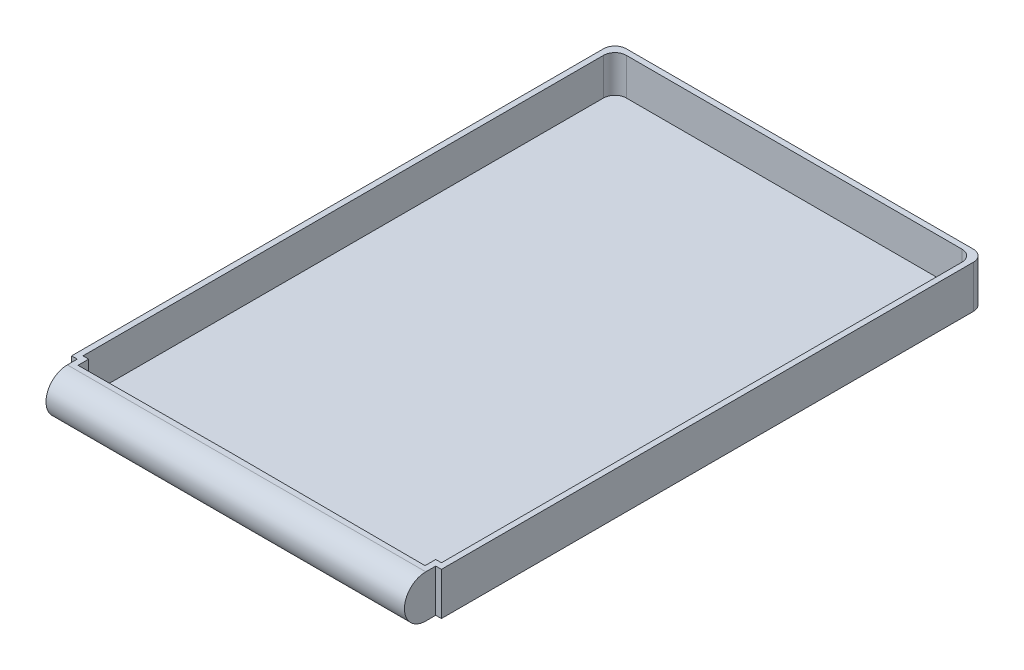
ISO-10303-21;
HEADER;
FILE_DESCRIPTION(('STEP AP214'),'2;1');
FILE_NAME('part.step','',(''),(''),'','','');
FILE_SCHEMA(('AUTOMOTIVE_DESIGN { 1 0 10303 214 1 1 1 1 }'));
ENDSEC;
DATA;
#1=APPLICATION_CONTEXT('core data for automotive mechanical design processes');
#2=APPLICATION_PROTOCOL_DEFINITION('international standard','automotive_design',2000,#1);
#3=PRODUCT_CONTEXT('',#1,'mechanical');
#4=PRODUCT('Part','Part','',(#3));
#5=PRODUCT_RELATED_PRODUCT_CATEGORY('part','',(#4));
#6=PRODUCT_DEFINITION_FORMATION('','',#4);
#7=PRODUCT_DEFINITION_CONTEXT('part definition',#1,'design');
#8=PRODUCT_DEFINITION('design','',#6,#7);
#9=PRODUCT_DEFINITION_SHAPE('','',#8);
#10=(LENGTH_UNIT() NAMED_UNIT(*) SI_UNIT(.MILLI.,.METRE.));
#11=(NAMED_UNIT(*) PLANE_ANGLE_UNIT() SI_UNIT($,.RADIAN.));
#12=(NAMED_UNIT(*) SI_UNIT($,.STERADIAN.) SOLID_ANGLE_UNIT());
#13=UNCERTAINTY_MEASURE_WITH_UNIT(LENGTH_MEASURE(1.E-05),#10,'distance_accuracy_value','');
#14=(GEOMETRIC_REPRESENTATION_CONTEXT(3) GLOBAL_UNCERTAINTY_ASSIGNED_CONTEXT((#13)) GLOBAL_UNIT_ASSIGNED_CONTEXT((#10,
#11,#12)) REPRESENTATION_CONTEXT('',''));
#15=CARTESIAN_POINT('',(0.,0.,0.));
#16=DIRECTION('',(0.,0.,1.));
#17=DIRECTION('',(1.,0.,0.));
#18=AXIS2_PLACEMENT_3D('',#15,#16,#17);
#19=CARTESIAN_POINT('',(128.,7.5,3.5));
#20=DIRECTION('',(-1.,0.,0.));
#21=DIRECTION('',(0.,0.,1.));
#22=AXIS2_PLACEMENT_3D('',#19,#20,#21);
#23=CYLINDRICAL_SURFACE('',#22,7.5);
#24=CARTESIAN_POINT('',(2.,7.5,3.5));
#25=DIRECTION('',(1.,0.,0.));
#26=DIRECTION('',(0.,0.,-1.));
#27=AXIS2_PLACEMENT_3D('',#24,#25,#26);
#28=CIRCLE('',#27,7.5);
#29=CARTESIAN_POINT('',(2.,0.,3.5));
#30=VERTEX_POINT('',#29);
#31=CARTESIAN_POINT('',(2.,15.,3.5));
#32=VERTEX_POINT('',#31);
#33=EDGE_CURVE('E280',#30,#32,#28,.F.);
#34=ORIENTED_EDGE('',*,*,#33,.F.);
#35=DIRECTION('',(-1.,0.,0.));
#36=VECTOR('',#35,1.);
#37=CARTESIAN_POINT('',(128.,0.,3.5));
#38=LINE('',#37,#36);
#39=CARTESIAN_POINT('',(128.,0.,3.5));
#40=VERTEX_POINT('',#39);
#41=EDGE_CURVE('E278',#40,#30,#38,.T.);
#42=ORIENTED_EDGE('',*,*,#41,.F.);
#43=CARTESIAN_POINT('',(128.,7.5,3.5));
#44=DIRECTION('',(1.,0.,0.));
#45=DIRECTION('',(0.,0.,-1.));
#46=AXIS2_PLACEMENT_3D('',#43,#44,#45);
#47=CIRCLE('',#46,7.5);
#48=CARTESIAN_POINT('',(128.,15.,3.5));
#49=VERTEX_POINT('',#48);
#50=EDGE_CURVE('E276',#49,#40,#47,.T.);
#51=ORIENTED_EDGE('',*,*,#50,.F.);
#52=DIRECTION('',(-1.,0.,0.));
#53=VECTOR('',#52,1.);
#54=CARTESIAN_POINT('',(128.,15.,3.5));
#55=LINE('',#54,#53);
#56=EDGE_CURVE('E61',#49,#32,#55,.T.);
#57=ORIENTED_EDGE('',*,*,#56,.T.);
#58=EDGE_LOOP('',(#34,#42,#51,#57));
#59=FACE_BOUND('',#58,.T.);
#60=ADVANCED_FACE('F38',(#59),#23,.T.);
#61=CARTESIAN_POINT('',(0.,15.,0.));
#62=DIRECTION('',(0.,1.,0.));
#63=DIRECTION('',(0.,0.,1.));
#64=AXIS2_PLACEMENT_3D('',#61,#62,#63);
#65=PLANE('',#64);
#66=DIRECTION('',(0.,0.,1.));
#67=VECTOR('',#66,1.);
#68=CARTESIAN_POINT('',(2.,15.,-80.0379219517663));
#69=LINE('',#68,#67);
#70=CARTESIAN_POINT('',(2.,15.,-185.));
#71=VERTEX_POINT('',#70);
#72=CARTESIAN_POINT('',(2.,15.,-2.));
#73=VERTEX_POINT('',#72);
#74=EDGE_CURVE('E187',#71,#73,#69,.T.);
#75=ORIENTED_EDGE('',*,*,#74,.F.);
#76=CARTESIAN_POINT('',(5.99999999999999,15.,-185.));
#77=DIRECTION('',(0.,1.,0.));
#78=DIRECTION('',(0.,0.,1.));
#79=AXIS2_PLACEMENT_3D('',#76,#77,#78);
#80=CIRCLE('',#79,4.);
#81=CARTESIAN_POINT('',(5.99999999999999,15.,-189.));
#82=VERTEX_POINT('',#81);
#83=EDGE_CURVE('E205',#82,#71,#80,.T.);
#84=ORIENTED_EDGE('',*,*,#83,.F.);
#85=DIRECTION('',(-1.,0.,0.));
#86=VECTOR('',#85,1.);
#87=CARTESIAN_POINT('',(5.99999999999999,15.,-189.));
#88=LINE('',#87,#86);
#89=CARTESIAN_POINT('',(124.,15.,-189.));
#90=VERTEX_POINT('',#89);
#91=EDGE_CURVE('E252',#90,#82,#88,.T.);
#92=ORIENTED_EDGE('',*,*,#91,.F.);
#93=CARTESIAN_POINT('',(124.,15.,-185.));
#94=DIRECTION('',(0.,1.,0.));
#95=DIRECTION('',(0.,0.,1.));
#96=AXIS2_PLACEMENT_3D('',#93,#94,#95);
#97=CIRCLE('',#96,4.00000000000002);
#98=CARTESIAN_POINT('',(128.,15.,-185.));
#99=VERTEX_POINT('',#98);
#100=EDGE_CURVE('E249',#99,#90,#97,.T.);
#101=ORIENTED_EDGE('',*,*,#100,.F.);
#102=DIRECTION('',(0.,0.,-1.));
#103=VECTOR('',#102,1.);
#104=CARTESIAN_POINT('',(128.,15.,-185.));
#105=LINE('',#104,#103);
#106=CARTESIAN_POINT('',(128.,15.,-2.));
#107=VERTEX_POINT('',#106);
#108=EDGE_CURVE('E246',#107,#99,#105,.T.);
#109=ORIENTED_EDGE('',*,*,#108,.F.);
#110=DIRECTION('',(1.,0.,0.));
#111=VECTOR('',#110,1.);
#112=CARTESIAN_POINT('',(128.,15.,-2.));
#113=LINE('',#112,#111);
#114=CARTESIAN_POINT('',(126.,15.,-2.));
#115=VERTEX_POINT('',#114);
#116=EDGE_CURVE('E243',#115,#107,#113,.T.);
#117=ORIENTED_EDGE('',*,*,#116,.F.);
#118=DIRECTION('',(0.,0.,-1.));
#119=VECTOR('',#118,1.);
#120=CARTESIAN_POINT('',(126.,15.,-2.));
#121=LINE('',#120,#119);
#122=CARTESIAN_POINT('',(126.,15.,1.75));
#123=VERTEX_POINT('',#122);
#124=EDGE_CURVE('E240',#123,#115,#121,.T.);
#125=ORIENTED_EDGE('',*,*,#124,.F.);
#126=DIRECTION('',(0.99999335764428,0.,0.00364481375631918));
#127=VECTOR('',#126,1.);
#128=CARTESIAN_POINT('',(126.,15.,1.75));
#129=LINE('',#128,#127);
#130=CARTESIAN_POINT('',(57.4098452965838,15.,1.5));
#131=VERTEX_POINT('',#130);
#132=EDGE_CURVE('E237',#131,#123,#129,.T.);
#133=ORIENTED_EDGE('',*,*,#132,.F.);
#134=DIRECTION('',(0.999989045306141,0.,-0.00468073367257118));
#135=VECTOR('',#134,1.);
#136=CARTESIAN_POINT('',(57.4098452965838,15.,1.5));
#137=LINE('',#136,#135);
#138=CARTESIAN_POINT('',(4.,15.,1.75));
#139=VERTEX_POINT('',#138);
#140=EDGE_CURVE('E234',#139,#131,#137,.T.);
#141=ORIENTED_EDGE('',*,*,#140,.F.);
#142=DIRECTION('',(0.,0.,1.));
#143=VECTOR('',#142,1.);
#144=CARTESIAN_POINT('',(4.,15.,-2.));
#145=LINE('',#144,#143);
#146=CARTESIAN_POINT('',(4.,15.,-2.));
#147=VERTEX_POINT('',#146);
#148=EDGE_CURVE('E231',#147,#139,#145,.T.);
#149=ORIENTED_EDGE('',*,*,#148,.F.);
#150=DIRECTION('',(1.,0.,0.));
#151=VECTOR('',#150,1.);
#152=CARTESIAN_POINT('',(2.,15.,-2.));
#153=LINE('',#152,#151);
#154=EDGE_CURVE('E229',#73,#147,#153,.T.);
#155=ORIENTED_EDGE('',*,*,#154,.F.);
#156=EDGE_LOOP('',(#75,#84,#92,#101,#109,#117,#125,#133,#141,#149,#155));
#157=FACE_BOUND('',#156,.T.);
#158=DIRECTION('',(0.,0.,1.));
#159=VECTOR('',#158,1.);
#160=CARTESIAN_POINT('',(2.,15.,0.));
#161=LINE('',#160,#159);
#162=CARTESIAN_POINT('',(2.,15.,0.));
#163=VERTEX_POINT('',#162);
#164=EDGE_CURVE('E301',#163,#32,#161,.T.);
#165=ORIENTED_EDGE('',*,*,#164,.T.);
#166=ORIENTED_EDGE('',*,*,#56,.F.);
#167=DIRECTION('',(0.,0.,1.));
#168=VECTOR('',#167,1.);
#169=CARTESIAN_POINT('',(128.,15.,0.));
#170=LINE('',#169,#168);
#171=CARTESIAN_POINT('',(128.,15.,0.));
#172=VERTEX_POINT('',#171);
#173=EDGE_CURVE('E303',#172,#49,#170,.T.);
#174=ORIENTED_EDGE('',*,*,#173,.F.);
#175=DIRECTION('',(1.,0.,0.));
#176=VECTOR('',#175,1.);
#177=CARTESIAN_POINT('',(0.,15.,0.));
#178=LINE('',#177,#176);
#179=CARTESIAN_POINT('',(130.,15.,0.));
#180=VERTEX_POINT('',#179);
#181=EDGE_CURVE('E305',#172,#180,#178,.T.);
#182=ORIENTED_EDGE('',*,*,#181,.T.);
#183=DIRECTION('',(0.,0.,-1.));
#184=VECTOR('',#183,1.);
#185=CARTESIAN_POINT('',(130.,15.,0.));
#186=LINE('',#185,#184);
#187=CARTESIAN_POINT('',(130.,15.,-187.));
#188=VERTEX_POINT('',#187);
#189=EDGE_CURVE('E284',#180,#188,#186,.T.);
#190=ORIENTED_EDGE('',*,*,#189,.T.);
#191=CARTESIAN_POINT('',(126.,15.,-187.));
#192=DIRECTION('',(0.,1.,0.));
#193=DIRECTION('',(0.,0.,1.));
#194=AXIS2_PLACEMENT_3D('',#191,#192,#193);
#195=CIRCLE('',#194,4.);
#196=CARTESIAN_POINT('',(126.,15.,-191.));
#197=VERTEX_POINT('',#196);
#198=EDGE_CURVE('E287',#188,#197,#195,.T.);
#199=ORIENTED_EDGE('',*,*,#198,.T.);
#200=DIRECTION('',(1.,0.,0.));
#201=VECTOR('',#200,1.);
#202=CARTESIAN_POINT('',(0.,15.,-191.));
#203=LINE('',#202,#201);
#204=CARTESIAN_POINT('',(4.,15.,-191.));
#205=VERTEX_POINT('',#204);
#206=EDGE_CURVE('E290',#205,#197,#203,.T.);
#207=ORIENTED_EDGE('',*,*,#206,.F.);
#208=CARTESIAN_POINT('',(4.,15.,-187.));
#209=DIRECTION('',(0.,1.,0.));
#210=DIRECTION('',(0.,0.,1.));
#211=AXIS2_PLACEMENT_3D('',#208,#209,#210);
#212=CIRCLE('',#211,4.);
#213=CARTESIAN_POINT('',(0.,15.,-187.));
#214=VERTEX_POINT('',#213);
#215=EDGE_CURVE('E293',#214,#205,#212,.F.);
#216=ORIENTED_EDGE('',*,*,#215,.F.);
#217=DIRECTION('',(0.,0.,-1.));
#218=VECTOR('',#217,1.);
#219=CARTESIAN_POINT('',(0.,15.,0.));
#220=LINE('',#219,#218);
#221=CARTESIAN_POINT('',(0.,15.,0.));
#222=VERTEX_POINT('',#221);
#223=EDGE_CURVE('E296',#222,#214,#220,.T.);
#224=ORIENTED_EDGE('',*,*,#223,.F.);
#225=DIRECTION('',(1.,0.,0.));
#226=VECTOR('',#225,1.);
#227=CARTESIAN_POINT('',(0.,15.,0.));
#228=LINE('',#227,#226);
#229=EDGE_CURVE('E299',#222,#163,#228,.T.);
#230=ORIENTED_EDGE('',*,*,#229,.T.);
#231=EDGE_LOOP('',(#165,#166,#174,#182,#190,#199,#207,#216,#224,#230));
#232=FACE_BOUND('',#231,.T.);
#233=ADVANCED_FACE('F360',(#157,#232),#65,.T.);
#234=CARTESIAN_POINT('',(0.,0.,0.));
#235=DIRECTION('',(0.,1.,0.));
#236=DIRECTION('',(0.,0.,1.));
#237=AXIS2_PLACEMENT_3D('',#234,#235,#236);
#238=PLANE('',#237);
#239=ORIENTED_EDGE('',*,*,#41,.T.);
#240=DIRECTION('',(0.,0.,1.));
#241=VECTOR('',#240,1.);
#242=CARTESIAN_POINT('',(2.,0.,0.));
#243=LINE('',#242,#241);
#244=CARTESIAN_POINT('',(2.,0.,0.));
#245=VERTEX_POINT('',#244);
#246=EDGE_CURVE('E324',#245,#30,#243,.T.);
#247=ORIENTED_EDGE('',*,*,#246,.F.);
#248=DIRECTION('',(1.,0.,0.));
#249=VECTOR('',#248,1.);
#250=CARTESIAN_POINT('',(0.,0.,0.));
#251=LINE('',#250,#249);
#252=CARTESIAN_POINT('',(0.,0.,0.));
#253=VERTEX_POINT('',#252);
#254=EDGE_CURVE('E322',#253,#245,#251,.T.);
#255=ORIENTED_EDGE('',*,*,#254,.F.);
#256=DIRECTION('',(0.,0.,-1.));
#257=VECTOR('',#256,1.);
#258=CARTESIAN_POINT('',(0.,0.,0.));
#259=LINE('',#258,#257);
#260=CARTESIAN_POINT('',(0.,0.,-187.));
#261=VERTEX_POINT('',#260);
#262=EDGE_CURVE('E319',#253,#261,#259,.T.);
#263=ORIENTED_EDGE('',*,*,#262,.T.);
#264=CARTESIAN_POINT('',(4.,0.,-187.));
#265=DIRECTION('',(0.,1.,0.));
#266=DIRECTION('',(0.,0.,1.));
#267=AXIS2_PLACEMENT_3D('',#264,#265,#266);
#268=CIRCLE('',#267,4.);
#269=CARTESIAN_POINT('',(4.,0.,-191.));
#270=VERTEX_POINT('',#269);
#271=EDGE_CURVE('E316',#261,#270,#268,.F.);
#272=ORIENTED_EDGE('',*,*,#271,.T.);
#273=DIRECTION('',(1.,0.,0.));
#274=VECTOR('',#273,1.);
#275=CARTESIAN_POINT('',(0.,0.,-191.));
#276=LINE('',#275,#274);
#277=CARTESIAN_POINT('',(126.,0.,-191.));
#278=VERTEX_POINT('',#277);
#279=EDGE_CURVE('E313',#270,#278,#276,.T.);
#280=ORIENTED_EDGE('',*,*,#279,.T.);
#281=CARTESIAN_POINT('',(126.,0.,-187.));
#282=DIRECTION('',(0.,1.,0.));
#283=DIRECTION('',(0.,0.,1.));
#284=AXIS2_PLACEMENT_3D('',#281,#282,#283);
#285=CIRCLE('',#284,4.);
#286=CARTESIAN_POINT('',(130.,0.,-187.));
#287=VERTEX_POINT('',#286);
#288=EDGE_CURVE('E310',#287,#278,#285,.T.);
#289=ORIENTED_EDGE('',*,*,#288,.F.);
#290=DIRECTION('',(0.,0.,-1.));
#291=VECTOR('',#290,1.);
#292=CARTESIAN_POINT('',(130.,0.,0.));
#293=LINE('',#292,#291);
#294=CARTESIAN_POINT('',(130.,0.,0.));
#295=VERTEX_POINT('',#294);
#296=EDGE_CURVE('E283',#295,#287,#293,.T.);
#297=ORIENTED_EDGE('',*,*,#296,.F.);
#298=DIRECTION('',(1.,0.,0.));
#299=VECTOR('',#298,1.);
#300=CARTESIAN_POINT('',(0.,0.,0.));
#301=LINE('',#300,#299);
#302=CARTESIAN_POINT('',(128.,0.,0.));
#303=VERTEX_POINT('',#302);
#304=EDGE_CURVE('E288',#303,#295,#301,.T.);
#305=ORIENTED_EDGE('',*,*,#304,.F.);
#306=DIRECTION('',(0.,0.,1.));
#307=VECTOR('',#306,1.);
#308=CARTESIAN_POINT('',(128.,0.,0.));
#309=LINE('',#308,#307);
#310=EDGE_CURVE('E327',#303,#40,#309,.T.);
#311=ORIENTED_EDGE('',*,*,#310,.T.);
#312=EDGE_LOOP('',(#239,#247,#255,#263,#272,#280,#289,#297,#305,#311));
#313=FACE_BOUND('',#312,.T.);
#314=ADVANCED_FACE('F353',(#313),#238,.F.);
#315=CARTESIAN_POINT('',(130.,15.,0.));
#316=DIRECTION('',(-1.,0.,0.));
#317=DIRECTION('',(0.,0.,1.));
#318=AXIS2_PLACEMENT_3D('',#315,#316,#317);
#319=PLANE('',#318);
#320=ORIENTED_EDGE('',*,*,#296,.T.);
#321=DIRECTION('',(0.,-1.,0.));
#322=VECTOR('',#321,1.);
#323=CARTESIAN_POINT('',(130.,15.,-187.));
#324=LINE('',#323,#322);
#325=EDGE_CURVE('E12',#188,#287,#324,.T.);
#326=ORIENTED_EDGE('',*,*,#325,.F.);
#327=ORIENTED_EDGE('',*,*,#189,.F.);
#328=DIRECTION('',(0.,-1.,0.));
#329=VECTOR('',#328,1.);
#330=CARTESIAN_POINT('',(130.,15.,0.));
#331=LINE('',#330,#329);
#332=EDGE_CURVE('E307',#180,#295,#331,.T.);
#333=ORIENTED_EDGE('',*,*,#332,.T.);
#334=EDGE_LOOP('',(#320,#326,#327,#333));
#335=FACE_BOUND('',#334,.T.);
#336=ADVANCED_FACE('F40',(#335),#319,.F.);
#337=CARTESIAN_POINT('',(126.,15.,-187.));
#338=DIRECTION('',(0.,-1.,0.));
#339=DIRECTION('',(0.,0.,-1.));
#340=AXIS2_PLACEMENT_3D('',#337,#338,#339);
#341=CYLINDRICAL_SURFACE('',#340,4.);
#342=ORIENTED_EDGE('',*,*,#288,.T.);
#343=DIRECTION('',(0.,-1.,0.));
#344=VECTOR('',#343,1.);
#345=CARTESIAN_POINT('',(126.,15.,-191.));
#346=LINE('',#345,#344);
#347=EDGE_CURVE('E46',#197,#278,#346,.T.);
#348=ORIENTED_EDGE('',*,*,#347,.F.);
#349=ORIENTED_EDGE('',*,*,#198,.F.);
#350=ORIENTED_EDGE('',*,*,#325,.T.);
#351=EDGE_LOOP('',(#342,#348,#349,#350));
#352=FACE_BOUND('',#351,.T.);
#353=ADVANCED_FACE('F349',(#352),#341,.T.);
#354=CARTESIAN_POINT('',(0.,15.,-191.));
#355=DIRECTION('',(0.,0.,-1.));
#356=DIRECTION('',(-1.,0.,0.));
#357=AXIS2_PLACEMENT_3D('',#354,#355,#356);
#358=PLANE('',#357);
#359=ORIENTED_EDGE('',*,*,#279,.F.);
#360=DIRECTION('',(0.,-1.,0.));
#361=VECTOR('',#360,1.);
#362=CARTESIAN_POINT('',(4.,15.,-191.));
#363=LINE('',#362,#361);
#364=EDGE_CURVE('E342',#205,#270,#363,.T.);
#365=ORIENTED_EDGE('',*,*,#364,.F.);
#366=ORIENTED_EDGE('',*,*,#206,.T.);
#367=ORIENTED_EDGE('',*,*,#347,.T.);
#368=EDGE_LOOP('',(#359,#365,#366,#367));
#369=FACE_BOUND('',#368,.T.);
#370=ADVANCED_FACE('F346',(#369),#358,.T.);
#371=CARTESIAN_POINT('',(4.,15.,-187.));
#372=DIRECTION('',(0.,-1.,0.));
#373=DIRECTION('',(0.,0.,-1.));
#374=AXIS2_PLACEMENT_3D('',#371,#372,#373);
#375=CYLINDRICAL_SURFACE('',#374,4.);
#376=ORIENTED_EDGE('',*,*,#271,.F.);
#377=DIRECTION('',(0.,-1.,0.));
#378=VECTOR('',#377,1.);
#379=CARTESIAN_POINT('',(0.,15.,-187.));
#380=LINE('',#379,#378);
#381=EDGE_CURVE('E340',#214,#261,#380,.T.);
#382=ORIENTED_EDGE('',*,*,#381,.F.);
#383=ORIENTED_EDGE('',*,*,#215,.T.);
#384=ORIENTED_EDGE('',*,*,#364,.T.);
#385=EDGE_LOOP('',(#376,#382,#383,#384));
#386=FACE_BOUND('',#385,.T.);
#387=ADVANCED_FACE('F358',(#386),#375,.T.);
#388=CARTESIAN_POINT('',(0.,15.,0.));
#389=DIRECTION('',(-1.,0.,0.));
#390=DIRECTION('',(0.,0.,1.));
#391=AXIS2_PLACEMENT_3D('',#388,#389,#390);
#392=PLANE('',#391);
#393=ORIENTED_EDGE('',*,*,#262,.F.);
#394=DIRECTION('',(0.,-1.,0.));
#395=VECTOR('',#394,1.);
#396=CARTESIAN_POINT('',(0.,15.,0.));
#397=LINE('',#396,#395);
#398=EDGE_CURVE('E338',#222,#253,#397,.T.);
#399=ORIENTED_EDGE('',*,*,#398,.F.);
#400=ORIENTED_EDGE('',*,*,#223,.T.);
#401=ORIENTED_EDGE('',*,*,#381,.T.);
#402=EDGE_LOOP('',(#393,#399,#400,#401));
#403=FACE_BOUND('',#402,.T.);
#404=ADVANCED_FACE('F384',(#403),#392,.T.);
#405=CARTESIAN_POINT('',(0.,15.,0.));
#406=DIRECTION('',(0.,0.,-1.));
#407=DIRECTION('',(-1.,0.,0.));
#408=AXIS2_PLACEMENT_3D('',#405,#406,#407);
#409=PLANE('',#408);
#410=ORIENTED_EDGE('',*,*,#254,.T.);
#411=DIRECTION('',(0.,-1.,0.));
#412=VECTOR('',#411,1.);
#413=CARTESIAN_POINT('',(2.,15.,0.));
#414=LINE('',#413,#412);
#415=EDGE_CURVE('E335',#163,#245,#414,.T.);
#416=ORIENTED_EDGE('',*,*,#415,.F.);
#417=ORIENTED_EDGE('',*,*,#229,.F.);
#418=ORIENTED_EDGE('',*,*,#398,.T.);
#419=EDGE_LOOP('',(#410,#416,#417,#418));
#420=FACE_BOUND('',#419,.T.);
#421=ADVANCED_FACE('F382',(#420),#409,.F.);
#422=CARTESIAN_POINT('',(2.,15.,0.));
#423=DIRECTION('',(1.,0.,0.));
#424=DIRECTION('',(0.,0.,-1.));
#425=AXIS2_PLACEMENT_3D('',#422,#423,#424);
#426=PLANE('',#425);
#427=ORIENTED_EDGE('',*,*,#246,.T.);
#428=ORIENTED_EDGE('',*,*,#33,.T.);
#429=ORIENTED_EDGE('',*,*,#164,.F.);
#430=ORIENTED_EDGE('',*,*,#415,.T.);
#431=EDGE_LOOP('',(#427,#428,#429,#430));
#432=FACE_BOUND('',#431,.T.);
#433=ADVANCED_FACE('F377',(#432),#426,.F.);
#434=CARTESIAN_POINT('',(128.,15.,0.));
#435=DIRECTION('',(1.,0.,0.));
#436=DIRECTION('',(0.,0.,-1.));
#437=AXIS2_PLACEMENT_3D('',#434,#435,#436);
#438=PLANE('',#437);
#439=ORIENTED_EDGE('',*,*,#50,.T.);
#440=ORIENTED_EDGE('',*,*,#310,.F.);
#441=DIRECTION('',(0.,-1.,0.));
#442=VECTOR('',#441,1.);
#443=CARTESIAN_POINT('',(128.,15.,0.));
#444=LINE('',#443,#442);
#445=EDGE_CURVE('E333',#172,#303,#444,.T.);
#446=ORIENTED_EDGE('',*,*,#445,.F.);
#447=ORIENTED_EDGE('',*,*,#173,.T.);
#448=EDGE_LOOP('',(#439,#440,#446,#447));
#449=FACE_BOUND('',#448,.T.);
#450=ADVANCED_FACE('F371',(#449),#438,.T.);
#451=CARTESIAN_POINT('',(0.,15.,0.));
#452=DIRECTION('',(0.,0.,-1.));
#453=DIRECTION('',(-1.,0.,0.));
#454=AXIS2_PLACEMENT_3D('',#451,#452,#453);
#455=PLANE('',#454);
#456=ORIENTED_EDGE('',*,*,#304,.T.);
#457=ORIENTED_EDGE('',*,*,#332,.F.);
#458=ORIENTED_EDGE('',*,*,#181,.F.);
#459=ORIENTED_EDGE('',*,*,#445,.T.);
#460=EDGE_LOOP('',(#456,#457,#458,#459));
#461=FACE_BOUND('',#460,.T.);
#462=ADVANCED_FACE('F405',(#461),#455,.F.);
#463=CARTESIAN_POINT('',(2.,2.,-80.0379219517663));
#464=DIRECTION('',(-1.,0.,0.));
#465=DIRECTION('',(0.,0.,1.));
#466=AXIS2_PLACEMENT_3D('',#463,#464,#465);
#467=PLANE('',#466);
#468=ORIENTED_EDGE('',*,*,#74,.T.);
#469=DIRECTION('',(0.,1.,0.));
#470=VECTOR('',#469,1.);
#471=CARTESIAN_POINT('',(2.,2.,-2.));
#472=LINE('',#471,#470);
#473=CARTESIAN_POINT('',(2.,2.,-2.));
#474=VERTEX_POINT('',#473);
#475=EDGE_CURVE('E53',#474,#73,#472,.T.);
#476=ORIENTED_EDGE('',*,*,#475,.F.);
#477=DIRECTION('',(0.,0.,1.));
#478=VECTOR('',#477,1.);
#479=CARTESIAN_POINT('',(2.,2.,-80.0379219517663));
#480=LINE('',#479,#478);
#481=CARTESIAN_POINT('',(2.,2.,-185.));
#482=VERTEX_POINT('',#481);
#483=EDGE_CURVE('E184',#482,#474,#480,.T.);
#484=ORIENTED_EDGE('',*,*,#483,.F.);
#485=DIRECTION('',(0.,1.,0.));
#486=VECTOR('',#485,1.);
#487=CARTESIAN_POINT('',(2.,2.,-185.));
#488=LINE('',#487,#486);
#489=EDGE_CURVE('E257',#482,#71,#488,.T.);
#490=ORIENTED_EDGE('',*,*,#489,.T.);
#491=EDGE_LOOP('',(#468,#476,#484,#490));
#492=FACE_BOUND('',#491,.T.);
#493=ADVANCED_FACE('F182',(#492),#467,.F.);
#494=CARTESIAN_POINT('',(5.99999999999999,2.,-185.));
#495=DIRECTION('',(0.,1.,0.));
#496=DIRECTION('',(0.,0.,1.));
#497=AXIS2_PLACEMENT_3D('',#494,#495,#496);
#498=CYLINDRICAL_SURFACE('',#497,4.);
#499=ORIENTED_EDGE('',*,*,#83,.T.);
#500=ORIENTED_EDGE('',*,*,#489,.F.);
#501=CARTESIAN_POINT('',(5.99999999999999,2.,-185.));
#502=DIRECTION('',(0.,1.,0.));
#503=DIRECTION('',(0.,0.,1.));
#504=AXIS2_PLACEMENT_3D('',#501,#502,#503);
#505=CIRCLE('',#504,4.);
#506=CARTESIAN_POINT('',(5.99999999999999,2.,-189.));
#507=VERTEX_POINT('',#506);
#508=EDGE_CURVE('E190',#507,#482,#505,.T.);
#509=ORIENTED_EDGE('',*,*,#508,.F.);
#510=DIRECTION('',(0.,1.,0.));
#511=VECTOR('',#510,1.);
#512=CARTESIAN_POINT('',(5.99999999999999,2.,-189.));
#513=LINE('',#512,#511);
#514=EDGE_CURVE('E259',#507,#82,#513,.T.);
#515=ORIENTED_EDGE('',*,*,#514,.T.);
#516=EDGE_LOOP('',(#499,#500,#509,#515));
#517=FACE_BOUND('',#516,.T.);
#518=ADVANCED_FACE('F431',(#517),#498,.F.);
#519=CARTESIAN_POINT('',(5.99999999999999,2.,-189.));
#520=DIRECTION('',(0.,0.,-1.));
#521=DIRECTION('',(-1.,0.,0.));
#522=AXIS2_PLACEMENT_3D('',#519,#520,#521);
#523=PLANE('',#522);
#524=ORIENTED_EDGE('',*,*,#91,.T.);
#525=ORIENTED_EDGE('',*,*,#514,.F.);
#526=DIRECTION('',(-1.,0.,0.));
#527=VECTOR('',#526,1.);
#528=CARTESIAN_POINT('',(5.99999999999999,2.,-189.));
#529=LINE('',#528,#527);
#530=CARTESIAN_POINT('',(124.,2.,-189.));
#531=VERTEX_POINT('',#530);
#532=EDGE_CURVE('E226',#531,#507,#529,.T.);
#533=ORIENTED_EDGE('',*,*,#532,.F.);
#534=DIRECTION('',(0.,1.,0.));
#535=VECTOR('',#534,1.);
#536=CARTESIAN_POINT('',(124.,2.,-189.));
#537=LINE('',#536,#535);
#538=EDGE_CURVE('E261',#531,#90,#537,.T.);
#539=ORIENTED_EDGE('',*,*,#538,.T.);
#540=EDGE_LOOP('',(#524,#525,#533,#539));
#541=FACE_BOUND('',#540,.T.);
#542=ADVANCED_FACE('F438',(#541),#523,.F.);
#543=CARTESIAN_POINT('',(124.,2.,-185.));
#544=DIRECTION('',(0.,1.,0.));
#545=DIRECTION('',(0.,0.,1.));
#546=AXIS2_PLACEMENT_3D('',#543,#544,#545);
#547=CYLINDRICAL_SURFACE('',#546,4.00000000000002);
#548=ORIENTED_EDGE('',*,*,#100,.T.);
#549=ORIENTED_EDGE('',*,*,#538,.F.);
#550=CARTESIAN_POINT('',(124.,2.,-185.));
#551=DIRECTION('',(0.,1.,0.));
#552=DIRECTION('',(0.,0.,1.));
#553=AXIS2_PLACEMENT_3D('',#550,#551,#552);
#554=CIRCLE('',#553,4.00000000000002);
#555=CARTESIAN_POINT('',(128.,2.,-185.));
#556=VERTEX_POINT('',#555);
#557=EDGE_CURVE('E223',#556,#531,#554,.T.);
#558=ORIENTED_EDGE('',*,*,#557,.F.);
#559=DIRECTION('',(0.,1.,0.));
#560=VECTOR('',#559,1.);
#561=CARTESIAN_POINT('',(128.,2.,-185.));
#562=LINE('',#561,#560);
#563=EDGE_CURVE('E263',#556,#99,#562,.T.);
#564=ORIENTED_EDGE('',*,*,#563,.T.);
#565=EDGE_LOOP('',(#548,#549,#558,#564));
#566=FACE_BOUND('',#565,.T.);
#567=ADVANCED_FACE('F446',(#566),#547,.F.);
#568=CARTESIAN_POINT('',(128.,2.,-185.));
#569=DIRECTION('',(1.,0.,0.));
#570=DIRECTION('',(0.,0.,-1.));
#571=AXIS2_PLACEMENT_3D('',#568,#569,#570);
#572=PLANE('',#571);
#573=ORIENTED_EDGE('',*,*,#108,.T.);
#574=ORIENTED_EDGE('',*,*,#563,.F.);
#575=DIRECTION('',(0.,0.,-1.));
#576=VECTOR('',#575,1.);
#577=CARTESIAN_POINT('',(128.,2.,-95.85074425055));
#578=LINE('',#577,#576);
#579=CARTESIAN_POINT('',(128.,2.,-2.));
#580=VERTEX_POINT('',#579);
#581=EDGE_CURVE('E221',#580,#556,#578,.T.);
#582=ORIENTED_EDGE('',*,*,#581,.F.);
#583=DIRECTION('',(0.,1.,0.));
#584=VECTOR('',#583,1.);
#585=CARTESIAN_POINT('',(128.,2.,-2.));
#586=LINE('',#585,#584);
#587=EDGE_CURVE('E265',#580,#107,#586,.T.);
#588=ORIENTED_EDGE('',*,*,#587,.T.);
#589=EDGE_LOOP('',(#573,#574,#582,#588));
#590=FACE_BOUND('',#589,.T.);
#591=ADVANCED_FACE('F454',(#590),#572,.F.);
#592=CARTESIAN_POINT('',(128.,2.,-2.));
#593=DIRECTION('',(0.,0.,1.));
#594=DIRECTION('',(1.,0.,0.));
#595=AXIS2_PLACEMENT_3D('',#592,#593,#594);
#596=PLANE('',#595);
#597=ORIENTED_EDGE('',*,*,#116,.T.);
#598=ORIENTED_EDGE('',*,*,#587,.F.);
#599=DIRECTION('',(1.,0.,0.));
#600=VECTOR('',#599,1.);
#601=CARTESIAN_POINT('',(128.,2.,-2.));
#602=LINE('',#601,#600);
#603=CARTESIAN_POINT('',(126.,2.,-2.));
#604=VERTEX_POINT('',#603);
#605=EDGE_CURVE('E218',#604,#580,#602,.T.);
#606=ORIENTED_EDGE('',*,*,#605,.F.);
#607=DIRECTION('',(0.,1.,0.));
#608=VECTOR('',#607,1.);
#609=CARTESIAN_POINT('',(126.,2.,-2.));
#610=LINE('',#609,#608);
#611=EDGE_CURVE('E267',#604,#115,#610,.T.);
#612=ORIENTED_EDGE('',*,*,#611,.T.);
#613=EDGE_LOOP('',(#597,#598,#606,#612));
#614=FACE_BOUND('',#613,.T.);
#615=ADVANCED_FACE('F462',(#614),#596,.F.);
#616=CARTESIAN_POINT('',(126.,2.,-2.));
#617=DIRECTION('',(1.,0.,0.));
#618=DIRECTION('',(0.,0.,-1.));
#619=AXIS2_PLACEMENT_3D('',#616,#617,#618);
#620=PLANE('',#619);
#621=ORIENTED_EDGE('',*,*,#124,.T.);
#622=ORIENTED_EDGE('',*,*,#611,.F.);
#623=DIRECTION('',(0.,0.,-1.));
#624=VECTOR('',#623,1.);
#625=CARTESIAN_POINT('',(126.,2.,-2.));
#626=LINE('',#625,#624);
#627=CARTESIAN_POINT('',(126.,2.,1.75));
#628=VERTEX_POINT('',#627);
#629=EDGE_CURVE('E215',#628,#604,#626,.T.);
#630=ORIENTED_EDGE('',*,*,#629,.F.);
#631=DIRECTION('',(0.,1.,0.));
#632=VECTOR('',#631,1.);
#633=CARTESIAN_POINT('',(126.,2.,1.75));
#634=LINE('',#633,#632);
#635=EDGE_CURVE('E269',#628,#123,#634,.T.);
#636=ORIENTED_EDGE('',*,*,#635,.T.);
#637=EDGE_LOOP('',(#621,#622,#630,#636));
#638=FACE_BOUND('',#637,.T.);
#639=ADVANCED_FACE('F470',(#638),#620,.F.);
#640=CARTESIAN_POINT('',(126.,2.,1.75));
#641=DIRECTION('',(-0.00364481375631918,0.,0.99999335764428));
#642=DIRECTION('',(0.999993357644281,0.,0.00364481375631919));
#643=AXIS2_PLACEMENT_3D('',#640,#641,#642);
#644=PLANE('',#643);
#645=ORIENTED_EDGE('',*,*,#132,.T.);
#646=ORIENTED_EDGE('',*,*,#635,.F.);
#647=DIRECTION('',(0.99999335764428,0.,0.00364481375631918));
#648=VECTOR('',#647,1.);
#649=CARTESIAN_POINT('',(126.,2.,1.75));
#650=LINE('',#649,#648);
#651=CARTESIAN_POINT('',(57.4098452965838,2.,1.5));
#652=VERTEX_POINT('',#651);
#653=EDGE_CURVE('E212',#652,#628,#650,.T.);
#654=ORIENTED_EDGE('',*,*,#653,.F.);
#655=DIRECTION('',(0.,1.,0.));
#656=VECTOR('',#655,1.);
#657=CARTESIAN_POINT('',(57.4098452965838,2.,1.5));
#658=LINE('',#657,#656);
#659=EDGE_CURVE('E271',#652,#131,#658,.T.);
#660=ORIENTED_EDGE('',*,*,#659,.T.);
#661=EDGE_LOOP('',(#645,#646,#654,#660));
#662=FACE_BOUND('',#661,.T.);
#663=ADVANCED_FACE('F478',(#662),#644,.F.);
#664=CARTESIAN_POINT('',(57.4098452965838,2.,1.5));
#665=DIRECTION('',(0.00468073367257117,0.,0.999989045306141));
#666=DIRECTION('',(0.999989045306141,0.,-0.00468073367257118));
#667=AXIS2_PLACEMENT_3D('',#664,#665,#666);
#668=PLANE('',#667);
#669=ORIENTED_EDGE('',*,*,#140,.T.);
#670=ORIENTED_EDGE('',*,*,#659,.F.);
#671=DIRECTION('',(0.999989045306141,0.,-0.00468073367257118));
#672=VECTOR('',#671,1.);
#673=CARTESIAN_POINT('',(57.4098452965838,2.,1.5));
#674=LINE('',#673,#672);
#675=CARTESIAN_POINT('',(4.,2.,1.75));
#676=VERTEX_POINT('',#675);
#677=EDGE_CURVE('E209',#676,#652,#674,.T.);
#678=ORIENTED_EDGE('',*,*,#677,.F.);
#679=DIRECTION('',(0.,1.,0.));
#680=VECTOR('',#679,1.);
#681=CARTESIAN_POINT('',(4.,2.,1.75));
#682=LINE('',#681,#680);
#683=EDGE_CURVE('E273',#676,#139,#682,.T.);
#684=ORIENTED_EDGE('',*,*,#683,.T.);
#685=EDGE_LOOP('',(#669,#670,#678,#684));
#686=FACE_BOUND('',#685,.T.);
#687=ADVANCED_FACE('F486',(#686),#668,.F.);
#688=CARTESIAN_POINT('',(4.,2.,-2.));
#689=DIRECTION('',(-1.,0.,0.));
#690=DIRECTION('',(0.,0.,1.));
#691=AXIS2_PLACEMENT_3D('',#688,#689,#690);
#692=PLANE('',#691);
#693=ORIENTED_EDGE('',*,*,#148,.T.);
#694=ORIENTED_EDGE('',*,*,#683,.F.);
#695=DIRECTION('',(0.,0.,1.));
#696=VECTOR('',#695,1.);
#697=CARTESIAN_POINT('',(4.,2.,-2.));
#698=LINE('',#697,#696);
#699=CARTESIAN_POINT('',(4.,2.,-2.));
#700=VERTEX_POINT('',#699);
#701=EDGE_CURVE('E198',#700,#676,#698,.T.);
#702=ORIENTED_EDGE('',*,*,#701,.F.);
#703=DIRECTION('',(0.,1.,0.));
#704=VECTOR('',#703,1.);
#705=CARTESIAN_POINT('',(4.,2.,-2.));
#706=LINE('',#705,#704);
#707=EDGE_CURVE('E189',#700,#147,#706,.T.);
#708=ORIENTED_EDGE('',*,*,#707,.T.);
#709=EDGE_LOOP('',(#693,#694,#702,#708));
#710=FACE_BOUND('',#709,.T.);
#711=ADVANCED_FACE('F494',(#710),#692,.F.);
#712=CARTESIAN_POINT('',(2.,2.,-2.));
#713=DIRECTION('',(0.,0.,1.));
#714=DIRECTION('',(1.,0.,0.));
#715=AXIS2_PLACEMENT_3D('',#712,#713,#714);
#716=PLANE('',#715);
#717=ORIENTED_EDGE('',*,*,#154,.T.);
#718=ORIENTED_EDGE('',*,*,#707,.F.);
#719=DIRECTION('',(1.,0.,0.));
#720=VECTOR('',#719,1.);
#721=CARTESIAN_POINT('',(2.,2.,-2.));
#722=LINE('',#721,#720);
#723=EDGE_CURVE('E193',#474,#700,#722,.T.);
#724=ORIENTED_EDGE('',*,*,#723,.F.);
#725=ORIENTED_EDGE('',*,*,#475,.T.);
#726=EDGE_LOOP('',(#717,#718,#724,#725));
#727=FACE_BOUND('',#726,.T.);
#728=ADVANCED_FACE('F194',(#727),#716,.F.);
#729=CARTESIAN_POINT('',(124.,2.,-185.));
#730=DIRECTION('',(0.,1.,0.));
#731=DIRECTION('',(0.,0.,1.));
#732=AXIS2_PLACEMENT_3D('',#729,#730,#731);
#733=PLANE('',#732);
#734=ORIENTED_EDGE('',*,*,#483,.T.);
#735=ORIENTED_EDGE('',*,*,#723,.T.);
#736=ORIENTED_EDGE('',*,*,#701,.T.);
#737=ORIENTED_EDGE('',*,*,#677,.T.);
#738=ORIENTED_EDGE('',*,*,#653,.T.);
#739=ORIENTED_EDGE('',*,*,#629,.T.);
#740=ORIENTED_EDGE('',*,*,#605,.T.);
#741=ORIENTED_EDGE('',*,*,#581,.T.);
#742=ORIENTED_EDGE('',*,*,#557,.T.);
#743=ORIENTED_EDGE('',*,*,#532,.T.);
#744=ORIENTED_EDGE('',*,*,#508,.T.);
#745=EDGE_LOOP('',(#734,#735,#736,#737,#738,#739,#740,#741,#742,#743,#744));
#746=FACE_BOUND('',#745,.T.);
#747=ADVANCED_FACE('F201',(#746),#733,.T.);
#748=CLOSED_SHELL('',(#60,#233,#314,#336,#353,#370,#387,#404,#421,#433,#450,#462,#493,#518,#542,
#567,#591,#615,#639,#663,#687,#711,#728,#747));
#749=MANIFOLD_SOLID_BREP('B2',#748);
#750=ADVANCED_BREP_SHAPE_REPRESENTATION('',(#18,#749),#14);
#751=SHAPE_DEFINITION_REPRESENTATION(#9,#750);
ENDSEC;
END-ISO-10303-21;
